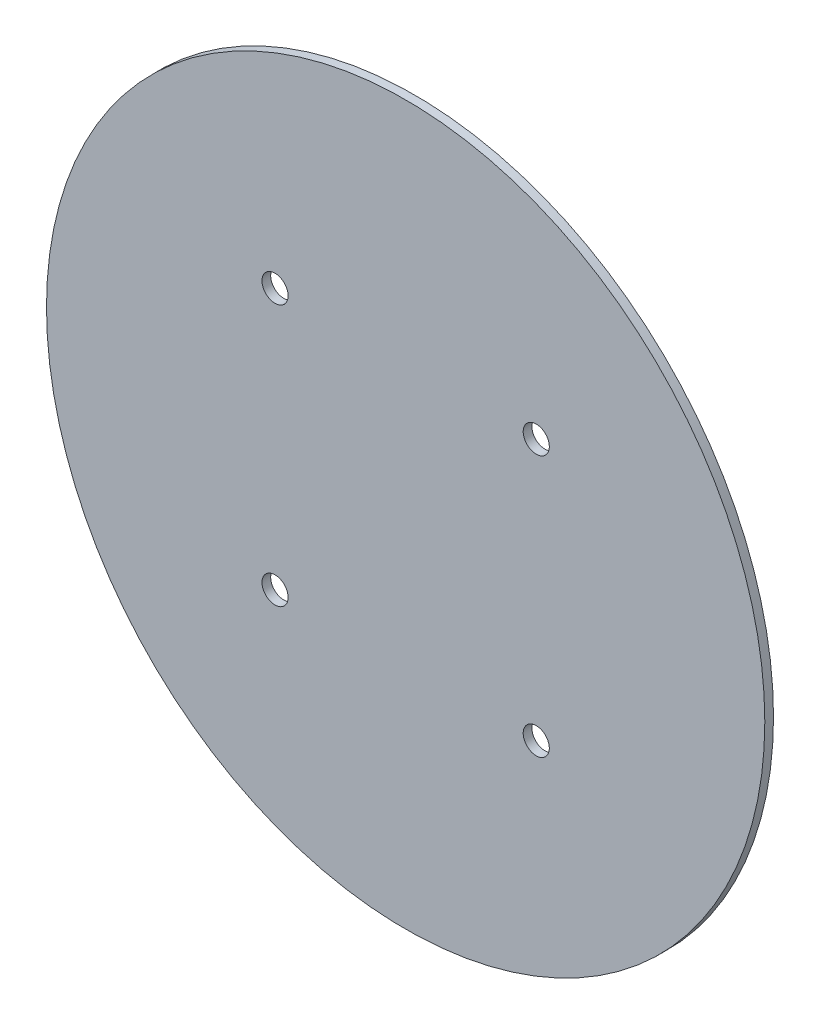
ISO-10303-21;
HEADER;
FILE_DESCRIPTION(('STEP AP214'),'2;1');
FILE_NAME('part.step','',(''),(''),'','','');
FILE_SCHEMA(('AUTOMOTIVE_DESIGN { 1 0 10303 214 1 1 1 1 }'));
ENDSEC;
DATA;
#1=APPLICATION_CONTEXT('core data for automotive mechanical design processes');
#2=APPLICATION_PROTOCOL_DEFINITION('international standard','automotive_design',2000,#1);
#3=PRODUCT_CONTEXT('',#1,'mechanical');
#4=PRODUCT('Part','Part','',(#3));
#5=PRODUCT_RELATED_PRODUCT_CATEGORY('part','',(#4));
#6=PRODUCT_DEFINITION_FORMATION('','',#4);
#7=PRODUCT_DEFINITION_CONTEXT('part definition',#1,'design');
#8=PRODUCT_DEFINITION('design','',#6,#7);
#9=PRODUCT_DEFINITION_SHAPE('','',#8);
#10=(LENGTH_UNIT() NAMED_UNIT(*) SI_UNIT(.MILLI.,.METRE.));
#11=(NAMED_UNIT(*) PLANE_ANGLE_UNIT() SI_UNIT($,.RADIAN.));
#12=(NAMED_UNIT(*) SI_UNIT($,.STERADIAN.) SOLID_ANGLE_UNIT());
#13=UNCERTAINTY_MEASURE_WITH_UNIT(LENGTH_MEASURE(1.E-05),#10,'distance_accuracy_value','');
#14=(GEOMETRIC_REPRESENTATION_CONTEXT(3) GLOBAL_UNCERTAINTY_ASSIGNED_CONTEXT((#13)) GLOBAL_UNIT_ASSIGNED_CONTEXT((#10,
#11,#12)) REPRESENTATION_CONTEXT('',''));
#15=CARTESIAN_POINT('',(0.,0.,0.));
#16=DIRECTION('',(0.,0.,1.));
#17=DIRECTION('',(1.,0.,0.));
#18=AXIS2_PLACEMENT_3D('',#15,#16,#17);
#19=CARTESIAN_POINT('',(0.,0.,2.));
#20=DIRECTION('',(0.,0.,-1.));
#21=DIRECTION('',(-1.,0.,0.));
#22=AXIS2_PLACEMENT_3D('',#19,#20,#21);
#23=CYLINDRICAL_SURFACE('',#22,82.5);
#24=CARTESIAN_POINT('',(0.,0.,2.));
#25=DIRECTION('',(0.,0.,1.));
#26=DIRECTION('',(1.,0.,0.));
#27=AXIS2_PLACEMENT_3D('',#24,#25,#26);
#28=CIRCLE('',#27,82.5);
#29=CARTESIAN_POINT('',(82.5,0.,2.));
#30=VERTEX_POINT('',#29);
#31=EDGE_CURVE('E10',#30,#30,#28,.T.);
#32=ORIENTED_EDGE('',*,*,#31,.F.);
#33=EDGE_LOOP('',(#32));
#34=FACE_BOUND('',#33,.T.);
#35=CARTESIAN_POINT('',(0.,0.,0.));
#36=DIRECTION('',(0.,0.,1.));
#37=DIRECTION('',(1.,0.,0.));
#38=AXIS2_PLACEMENT_3D('',#35,#36,#37);
#39=CIRCLE('',#38,82.5);
#40=CARTESIAN_POINT('',(82.5,0.,0.));
#41=VERTEX_POINT('',#40);
#42=EDGE_CURVE('E38',#41,#41,#39,.T.);
#43=ORIENTED_EDGE('',*,*,#42,.T.);
#44=EDGE_LOOP('',(#43));
#45=FACE_BOUND('',#44,.T.);
#46=ADVANCED_FACE('F35',(#34,#45),#23,.T.);
#47=CARTESIAN_POINT('',(0.,0.,2.));
#48=DIRECTION('',(0.,0.,1.));
#49=DIRECTION('',(1.,0.,0.));
#50=AXIS2_PLACEMENT_3D('',#47,#48,#49);
#51=PLANE('',#50);
#52=CARTESIAN_POINT('',(30.,-30.,2.));
#53=DIRECTION('',(0.,0.,1.));
#54=DIRECTION('',(1.,0.,0.));
#55=AXIS2_PLACEMENT_3D('',#52,#53,#54);
#56=CIRCLE('',#55,3.);
#57=CARTESIAN_POINT('',(33.,-30.,2.));
#58=VERTEX_POINT('',#57);
#59=EDGE_CURVE('E53',#58,#58,#56,.T.);
#60=ORIENTED_EDGE('',*,*,#59,.F.);
#61=EDGE_LOOP('',(#60));
#62=FACE_BOUND('',#61,.T.);
#63=CARTESIAN_POINT('',(-30.,-30.,2.));
#64=DIRECTION('',(0.,0.,1.));
#65=DIRECTION('',(1.,0.,0.));
#66=AXIS2_PLACEMENT_3D('',#63,#64,#65);
#67=CIRCLE('',#66,3.);
#68=CARTESIAN_POINT('',(-27.,-30.,2.));
#69=VERTEX_POINT('',#68);
#70=EDGE_CURVE('E59',#69,#69,#67,.T.);
#71=ORIENTED_EDGE('',*,*,#70,.F.);
#72=EDGE_LOOP('',(#71));
#73=FACE_BOUND('',#72,.T.);
#74=CARTESIAN_POINT('',(-30.,30.,2.));
#75=DIRECTION('',(0.,0.,1.));
#76=DIRECTION('',(1.,0.,0.));
#77=AXIS2_PLACEMENT_3D('',#74,#75,#76);
#78=CIRCLE('',#77,3.);
#79=CARTESIAN_POINT('',(-27.,30.,2.));
#80=VERTEX_POINT('',#79);
#81=EDGE_CURVE('E65',#80,#80,#78,.T.);
#82=ORIENTED_EDGE('',*,*,#81,.F.);
#83=EDGE_LOOP('',(#82));
#84=FACE_BOUND('',#83,.T.);
#85=CARTESIAN_POINT('',(30.,30.,2.));
#86=DIRECTION('',(0.,0.,1.));
#87=DIRECTION('',(1.,0.,0.));
#88=AXIS2_PLACEMENT_3D('',#85,#86,#87);
#89=CIRCLE('',#88,3.);
#90=CARTESIAN_POINT('',(33.,30.,2.));
#91=VERTEX_POINT('',#90);
#92=EDGE_CURVE('E47',#91,#91,#89,.T.);
#93=ORIENTED_EDGE('',*,*,#92,.F.);
#94=EDGE_LOOP('',(#93));
#95=FACE_BOUND('',#94,.T.);
#96=ORIENTED_EDGE('',*,*,#31,.T.);
#97=EDGE_LOOP('',(#96));
#98=FACE_BOUND('',#97,.T.);
#99=ADVANCED_FACE('F82',(#62,#73,#84,#95,#98),#51,.T.);
#100=CARTESIAN_POINT('',(0.,0.,0.));
#101=DIRECTION('',(0.,0.,1.));
#102=DIRECTION('',(1.,0.,0.));
#103=AXIS2_PLACEMENT_3D('',#100,#101,#102);
#104=PLANE('',#103);
#105=CARTESIAN_POINT('',(30.,-30.,0.));
#106=DIRECTION('',(0.,0.,1.));
#107=DIRECTION('',(1.,0.,0.));
#108=AXIS2_PLACEMENT_3D('',#105,#106,#107);
#109=CIRCLE('',#108,3.);
#110=CARTESIAN_POINT('',(33.,-30.,0.));
#111=VERTEX_POINT('',#110);
#112=EDGE_CURVE('E56',#111,#111,#109,.T.);
#113=ORIENTED_EDGE('',*,*,#112,.T.);
#114=EDGE_LOOP('',(#113));
#115=FACE_BOUND('',#114,.T.);
#116=CARTESIAN_POINT('',(-30.,-30.,0.));
#117=DIRECTION('',(0.,0.,1.));
#118=DIRECTION('',(1.,0.,0.));
#119=AXIS2_PLACEMENT_3D('',#116,#117,#118);
#120=CIRCLE('',#119,3.);
#121=CARTESIAN_POINT('',(-27.,-30.,0.));
#122=VERTEX_POINT('',#121);
#123=EDGE_CURVE('E62',#122,#122,#120,.T.);
#124=ORIENTED_EDGE('',*,*,#123,.T.);
#125=EDGE_LOOP('',(#124));
#126=FACE_BOUND('',#125,.T.);
#127=CARTESIAN_POINT('',(-30.,30.,0.));
#128=DIRECTION('',(0.,0.,1.));
#129=DIRECTION('',(1.,0.,0.));
#130=AXIS2_PLACEMENT_3D('',#127,#128,#129);
#131=CIRCLE('',#130,3.);
#132=CARTESIAN_POINT('',(-27.,30.,0.));
#133=VERTEX_POINT('',#132);
#134=EDGE_CURVE('E50',#133,#133,#131,.T.);
#135=ORIENTED_EDGE('',*,*,#134,.T.);
#136=EDGE_LOOP('',(#135));
#137=FACE_BOUND('',#136,.T.);
#138=CARTESIAN_POINT('',(30.,30.,0.));
#139=DIRECTION('',(0.,0.,1.));
#140=DIRECTION('',(1.,0.,0.));
#141=AXIS2_PLACEMENT_3D('',#138,#139,#140);
#142=CIRCLE('',#141,3.);
#143=CARTESIAN_POINT('',(33.,30.,0.));
#144=VERTEX_POINT('',#143);
#145=EDGE_CURVE('E45',#144,#144,#142,.T.);
#146=ORIENTED_EDGE('',*,*,#145,.T.);
#147=EDGE_LOOP('',(#146));
#148=FACE_BOUND('',#147,.T.);
#149=ORIENTED_EDGE('',*,*,#42,.F.);
#150=EDGE_LOOP('',(#149));
#151=FACE_BOUND('',#150,.T.);
#152=ADVANCED_FACE('F71',(#115,#126,#137,#148,#151),#104,.F.);
#153=CARTESIAN_POINT('',(30.,30.,0.));
#154=DIRECTION('',(0.,0.,1.));
#155=DIRECTION('',(1.,0.,0.));
#156=AXIS2_PLACEMENT_3D('',#153,#154,#155);
#157=CYLINDRICAL_SURFACE('',#156,3.);
#158=ORIENTED_EDGE('',*,*,#145,.F.);
#159=EDGE_LOOP('',(#158));
#160=FACE_BOUND('',#159,.T.);
#161=ORIENTED_EDGE('',*,*,#92,.T.);
#162=EDGE_LOOP('',(#161));
#163=FACE_BOUND('',#162,.T.);
#164=ADVANCED_FACE('F78',(#160,#163),#157,.F.);
#165=CARTESIAN_POINT('',(-30.,30.,0.));
#166=DIRECTION('',(0.,0.,1.));
#167=DIRECTION('',(1.,0.,0.));
#168=AXIS2_PLACEMENT_3D('',#165,#166,#167);
#169=CYLINDRICAL_SURFACE('',#168,3.);
#170=ORIENTED_EDGE('',*,*,#134,.F.);
#171=EDGE_LOOP('',(#170));
#172=FACE_BOUND('',#171,.T.);
#173=ORIENTED_EDGE('',*,*,#81,.T.);
#174=EDGE_LOOP('',(#173));
#175=FACE_BOUND('',#174,.T.);
#176=ADVANCED_FACE('F74',(#172,#175),#169,.F.);
#177=CARTESIAN_POINT('',(-30.,-30.,0.));
#178=DIRECTION('',(0.,0.,1.));
#179=DIRECTION('',(1.,0.,0.));
#180=AXIS2_PLACEMENT_3D('',#177,#178,#179);
#181=CYLINDRICAL_SURFACE('',#180,3.);
#182=ORIENTED_EDGE('',*,*,#123,.F.);
#183=EDGE_LOOP('',(#182));
#184=FACE_BOUND('',#183,.T.);
#185=ORIENTED_EDGE('',*,*,#70,.T.);
#186=EDGE_LOOP('',(#185));
#187=FACE_BOUND('',#186,.T.);
#188=ADVANCED_FACE('F77',(#184,#187),#181,.F.);
#189=CARTESIAN_POINT('',(30.,-30.,0.));
#190=DIRECTION('',(0.,0.,1.));
#191=DIRECTION('',(1.,0.,0.));
#192=AXIS2_PLACEMENT_3D('',#189,#190,#191);
#193=CYLINDRICAL_SURFACE('',#192,3.);
#194=ORIENTED_EDGE('',*,*,#112,.F.);
#195=EDGE_LOOP('',(#194));
#196=FACE_BOUND('',#195,.T.);
#197=ORIENTED_EDGE('',*,*,#59,.T.);
#198=EDGE_LOOP('',(#197));
#199=FACE_BOUND('',#198,.T.);
#200=ADVANCED_FACE('F132',(#196,#199),#193,.F.);
#201=CLOSED_SHELL('',(#46,#99,#152,#164,#176,#188,#200));
#202=MANIFOLD_SOLID_BREP('B2',#201);
#203=ADVANCED_BREP_SHAPE_REPRESENTATION('',(#18,#202),#14);
#204=SHAPE_DEFINITION_REPRESENTATION(#9,#203);
ENDSEC;
END-ISO-10303-21;
